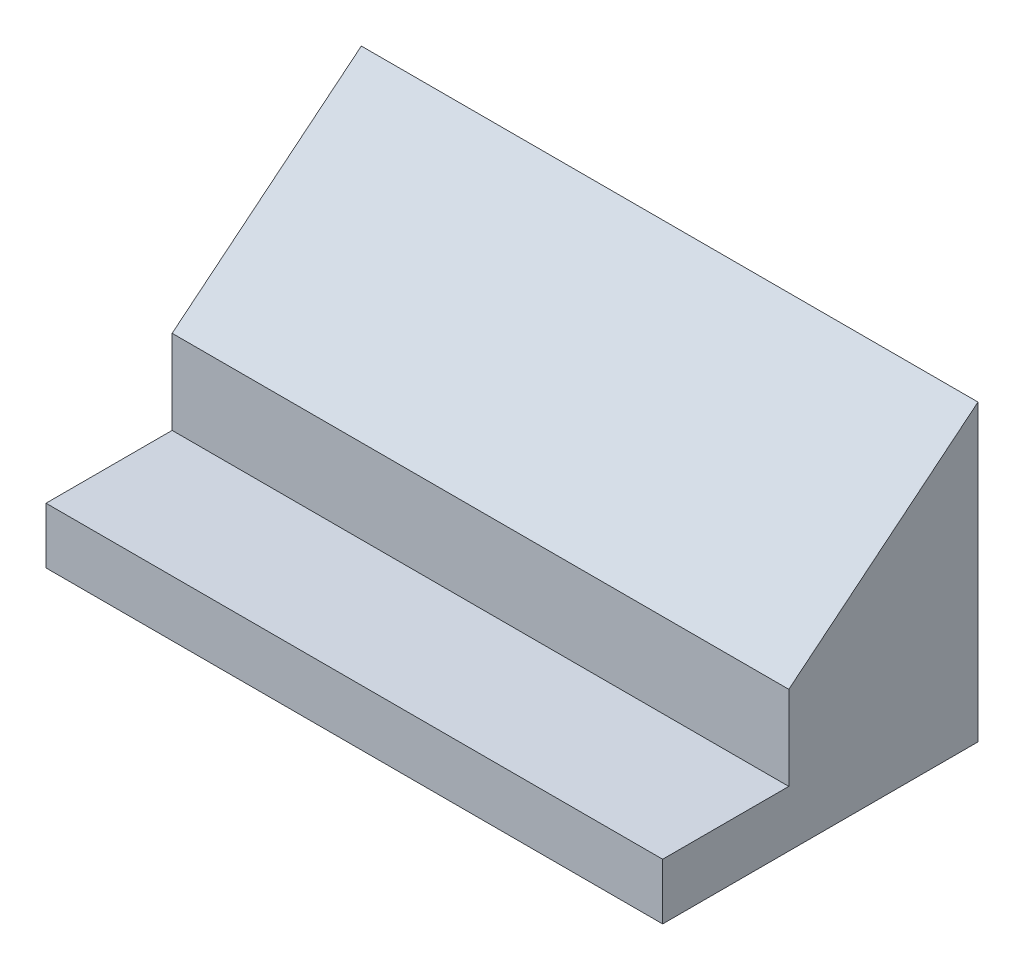
ISO-10303-21;
HEADER;
FILE_DESCRIPTION(('STEP AP214'),'2;1');
FILE_NAME('part.step','',(''),(''),'','','');
FILE_SCHEMA(('AUTOMOTIVE_DESIGN { 1 0 10303 214 1 1 1 1 }'));
ENDSEC;
DATA;
#1=APPLICATION_CONTEXT('core data for automotive mechanical design processes');
#2=APPLICATION_PROTOCOL_DEFINITION('international standard','automotive_design',2000,#1);
#3=PRODUCT_CONTEXT('',#1,'mechanical');
#4=PRODUCT('Part','Part','',(#3));
#5=PRODUCT_RELATED_PRODUCT_CATEGORY('part','',(#4));
#6=PRODUCT_DEFINITION_FORMATION('','',#4);
#7=PRODUCT_DEFINITION_CONTEXT('part definition',#1,'design');
#8=PRODUCT_DEFINITION('design','',#6,#7);
#9=PRODUCT_DEFINITION_SHAPE('','',#8);
#10=(LENGTH_UNIT() NAMED_UNIT(*) SI_UNIT(.MILLI.,.METRE.));
#11=(NAMED_UNIT(*) PLANE_ANGLE_UNIT() SI_UNIT($,.RADIAN.));
#12=(NAMED_UNIT(*) SI_UNIT($,.STERADIAN.) SOLID_ANGLE_UNIT());
#13=UNCERTAINTY_MEASURE_WITH_UNIT(LENGTH_MEASURE(1.E-05),#10,'distance_accuracy_value','');
#14=(GEOMETRIC_REPRESENTATION_CONTEXT(3) GLOBAL_UNCERTAINTY_ASSIGNED_CONTEXT((#13)) GLOBAL_UNIT_ASSIGNED_CONTEXT((#10,
#11,#12)) REPRESENTATION_CONTEXT('',''));
#15=CARTESIAN_POINT('',(0.,0.,0.));
#16=DIRECTION('',(0.,0.,1.));
#17=DIRECTION('',(1.,0.,0.));
#18=AXIS2_PLACEMENT_3D('',#15,#16,#17);
#19=CARTESIAN_POINT('',(8.8,0.,0.));
#20=DIRECTION('',(0.,0.,-1.));
#21=DIRECTION('',(-1.,0.,0.));
#22=AXIS2_PLACEMENT_3D('',#19,#20,#21);
#23=PLANE('',#22);
#24=DIRECTION('',(0.,-1.,0.));
#25=VECTOR('',#24,1.);
#26=CARTESIAN_POINT('',(0.,0.,0.));
#27=LINE('',#26,#25);
#28=CARTESIAN_POINT('',(0.,0.8,0.));
#29=VERTEX_POINT('',#28);
#30=CARTESIAN_POINT('',(0.,0.,0.));
#31=VERTEX_POINT('',#30);
#32=EDGE_CURVE('E128',#29,#31,#27,.T.);
#33=ORIENTED_EDGE('',*,*,#32,.T.);
#34=DIRECTION('',(-1.,0.,0.));
#35=VECTOR('',#34,1.);
#36=CARTESIAN_POINT('',(8.8,0.,0.));
#37=LINE('',#36,#35);
#38=CARTESIAN_POINT('',(8.8,0.,0.));
#39=VERTEX_POINT('',#38);
#40=EDGE_CURVE('E11',#39,#31,#37,.T.);
#41=ORIENTED_EDGE('',*,*,#40,.F.);
#42=DIRECTION('',(0.,-1.,0.));
#43=VECTOR('',#42,1.);
#44=CARTESIAN_POINT('',(8.8,0.,0.));
#45=LINE('',#44,#43);
#46=CARTESIAN_POINT('',(8.8,0.8,0.));
#47=VERTEX_POINT('',#46);
#48=EDGE_CURVE('E144',#47,#39,#45,.T.);
#49=ORIENTED_EDGE('',*,*,#48,.F.);
#50=DIRECTION('',(-1.,0.,0.));
#51=VECTOR('',#50,1.);
#52=CARTESIAN_POINT('',(8.8,0.8,0.));
#53=LINE('',#52,#51);
#54=EDGE_CURVE('E124',#47,#29,#53,.T.);
#55=ORIENTED_EDGE('',*,*,#54,.T.);
#56=EDGE_LOOP('',(#33,#41,#49,#55));
#57=FACE_BOUND('',#56,.T.);
#58=ADVANCED_FACE('F39',(#57),#23,.F.);
#59=CARTESIAN_POINT('',(8.8,0.,0.));
#60=DIRECTION('',(0.,1.,0.));
#61=DIRECTION('',(0.,0.,1.));
#62=AXIS2_PLACEMENT_3D('',#59,#60,#61);
#63=PLANE('',#62);
#64=DIRECTION('',(0.,0.,-1.));
#65=VECTOR('',#64,1.);
#66=CARTESIAN_POINT('',(0.,0.,0.));
#67=LINE('',#66,#65);
#68=CARTESIAN_POINT('',(0.,0.,-4.5));
#69=VERTEX_POINT('',#68);
#70=EDGE_CURVE('E132',#31,#69,#67,.T.);
#71=ORIENTED_EDGE('',*,*,#70,.T.);
#72=DIRECTION('',(-1.,0.,0.));
#73=VECTOR('',#72,1.);
#74=CARTESIAN_POINT('',(8.8,0.,-4.5));
#75=LINE('',#74,#73);
#76=CARTESIAN_POINT('',(8.8,0.,-4.5));
#77=VERTEX_POINT('',#76);
#78=EDGE_CURVE('E48',#77,#69,#75,.T.);
#79=ORIENTED_EDGE('',*,*,#78,.F.);
#80=DIRECTION('',(0.,0.,-1.));
#81=VECTOR('',#80,1.);
#82=CARTESIAN_POINT('',(8.8,0.,0.));
#83=LINE('',#82,#81);
#84=EDGE_CURVE('E93',#39,#77,#83,.T.);
#85=ORIENTED_EDGE('',*,*,#84,.F.);
#86=ORIENTED_EDGE('',*,*,#40,.T.);
#87=EDGE_LOOP('',(#71,#79,#85,#86));
#88=FACE_BOUND('',#87,.T.);
#89=ADVANCED_FACE('F172',(#88),#63,.F.);
#90=CARTESIAN_POINT('',(8.8,0.,-4.5));
#91=DIRECTION('',(0.,0.,1.));
#92=DIRECTION('',(1.,0.,0.));
#93=AXIS2_PLACEMENT_3D('',#90,#91,#92);
#94=PLANE('',#93);
#95=DIRECTION('',(0.,1.,0.));
#96=VECTOR('',#95,1.);
#97=CARTESIAN_POINT('',(0.,0.,-4.5));
#98=LINE('',#97,#96);
#99=CARTESIAN_POINT('',(0.,4.2,-4.5));
#100=VERTEX_POINT('',#99);
#101=EDGE_CURVE('E135',#69,#100,#98,.T.);
#102=ORIENTED_EDGE('',*,*,#101,.T.);
#103=DIRECTION('',(-1.,0.,0.));
#104=VECTOR('',#103,1.);
#105=CARTESIAN_POINT('',(8.8,4.2,-4.5));
#106=LINE('',#105,#104);
#107=CARTESIAN_POINT('',(8.8,4.2,-4.5));
#108=VERTEX_POINT('',#107);
#109=EDGE_CURVE('E117',#108,#100,#106,.T.);
#110=ORIENTED_EDGE('',*,*,#109,.F.);
#111=DIRECTION('',(0.,1.,0.));
#112=VECTOR('',#111,1.);
#113=CARTESIAN_POINT('',(8.8,0.,-4.5));
#114=LINE('',#113,#112);
#115=EDGE_CURVE('E106',#77,#108,#114,.T.);
#116=ORIENTED_EDGE('',*,*,#115,.F.);
#117=ORIENTED_EDGE('',*,*,#78,.T.);
#118=EDGE_LOOP('',(#102,#110,#116,#117));
#119=FACE_BOUND('',#118,.T.);
#120=ADVANCED_FACE('F154',(#119),#94,.F.);
#121=CARTESIAN_POINT('',(8.8,2.,-1.8));
#122=DIRECTION('',(0.,-0.775234985517289,-0.631672951162236));
#123=DIRECTION('',(0.,0.631672951162236,-0.775234985517289));
#124=AXIS2_PLACEMENT_3D('',#121,#122,#123);
#125=PLANE('',#124);
#126=DIRECTION('',(0.,-0.631672951162236,0.775234985517289));
#127=VECTOR('',#126,1.);
#128=CARTESIAN_POINT('',(0.,2.,-1.8));
#129=LINE('',#128,#127);
#130=CARTESIAN_POINT('',(0.,2.,-1.8));
#131=VERTEX_POINT('',#130);
#132=EDGE_CURVE('E115',#100,#131,#129,.T.);
#133=ORIENTED_EDGE('',*,*,#132,.T.);
#134=DIRECTION('',(-1.,0.,0.));
#135=VECTOR('',#134,1.);
#136=CARTESIAN_POINT('',(8.8,2.,-1.8));
#137=LINE('',#136,#135);
#138=CARTESIAN_POINT('',(8.8,2.,-1.8));
#139=VERTEX_POINT('',#138);
#140=EDGE_CURVE('E112',#139,#131,#137,.T.);
#141=ORIENTED_EDGE('',*,*,#140,.F.);
#142=DIRECTION('',(0.,-0.631672951162236,0.775234985517289));
#143=VECTOR('',#142,1.);
#144=CARTESIAN_POINT('',(8.8,2.,-1.8));
#145=LINE('',#144,#143);
#146=EDGE_CURVE('E100',#108,#139,#145,.T.);
#147=ORIENTED_EDGE('',*,*,#146,.F.);
#148=ORIENTED_EDGE('',*,*,#109,.T.);
#149=EDGE_LOOP('',(#133,#141,#147,#148));
#150=FACE_BOUND('',#149,.T.);
#151=ADVANCED_FACE('F113',(#150),#125,.F.);
#152=CARTESIAN_POINT('',(8.8,0.8,-1.8));
#153=DIRECTION('',(0.,0.,-1.));
#154=DIRECTION('',(-1.,0.,0.));
#155=AXIS2_PLACEMENT_3D('',#152,#153,#154);
#156=PLANE('',#155);
#157=DIRECTION('',(0.,-1.,0.));
#158=VECTOR('',#157,1.);
#159=CARTESIAN_POINT('',(0.,0.8,-1.8));
#160=LINE('',#159,#158);
#161=CARTESIAN_POINT('',(0.,0.8,-1.8));
#162=VERTEX_POINT('',#161);
#163=EDGE_CURVE('E79',#131,#162,#160,.T.);
#164=ORIENTED_EDGE('',*,*,#163,.T.);
#165=DIRECTION('',(-1.,0.,0.));
#166=VECTOR('',#165,1.);
#167=CARTESIAN_POINT('',(8.8,0.8,-1.8));
#168=LINE('',#167,#166);
#169=CARTESIAN_POINT('',(8.8,0.8,-1.8));
#170=VERTEX_POINT('',#169);
#171=EDGE_CURVE('E118',#170,#162,#168,.T.);
#172=ORIENTED_EDGE('',*,*,#171,.F.);
#173=DIRECTION('',(0.,-1.,0.));
#174=VECTOR('',#173,1.);
#175=CARTESIAN_POINT('',(8.8,0.8,-1.8));
#176=LINE('',#175,#174);
#177=EDGE_CURVE('E104',#139,#170,#176,.T.);
#178=ORIENTED_EDGE('',*,*,#177,.F.);
#179=ORIENTED_EDGE('',*,*,#140,.T.);
#180=EDGE_LOOP('',(#164,#172,#178,#179));
#181=FACE_BOUND('',#180,.T.);
#182=ADVANCED_FACE('F120',(#181),#156,.F.);
#183=CARTESIAN_POINT('',(8.8,0.8,0.));
#184=DIRECTION('',(0.,-1.,0.));
#185=DIRECTION('',(0.,0.,-1.));
#186=AXIS2_PLACEMENT_3D('',#183,#184,#185);
#187=PLANE('',#186);
#188=DIRECTION('',(0.,0.,1.));
#189=VECTOR('',#188,1.);
#190=CARTESIAN_POINT('',(0.,0.8,0.));
#191=LINE('',#190,#189);
#192=EDGE_CURVE('E85',#162,#29,#191,.T.);
#193=ORIENTED_EDGE('',*,*,#192,.T.);
#194=ORIENTED_EDGE('',*,*,#54,.F.);
#195=DIRECTION('',(0.,0.,1.));
#196=VECTOR('',#195,1.);
#197=CARTESIAN_POINT('',(8.8,0.8,0.));
#198=LINE('',#197,#196);
#199=EDGE_CURVE('E56',#170,#47,#198,.T.);
#200=ORIENTED_EDGE('',*,*,#199,.F.);
#201=ORIENTED_EDGE('',*,*,#171,.T.);
#202=EDGE_LOOP('',(#193,#194,#200,#201));
#203=FACE_BOUND('',#202,.T.);
#204=ADVANCED_FACE('F161',(#203),#187,.F.);
#205=CARTESIAN_POINT('',(8.8,0.,0.));
#206=DIRECTION('',(-1.,0.,0.));
#207=DIRECTION('',(0.,0.,1.));
#208=AXIS2_PLACEMENT_3D('',#205,#206,#207);
#209=PLANE('',#208);
#210=ORIENTED_EDGE('',*,*,#48,.T.);
#211=ORIENTED_EDGE('',*,*,#84,.T.);
#212=ORIENTED_EDGE('',*,*,#115,.T.);
#213=ORIENTED_EDGE('',*,*,#146,.T.);
#214=ORIENTED_EDGE('',*,*,#177,.T.);
#215=ORIENTED_EDGE('',*,*,#199,.T.);
#216=EDGE_LOOP('',(#210,#211,#212,#213,#214,#215));
#217=FACE_BOUND('',#216,.T.);
#218=ADVANCED_FACE('F102',(#217),#209,.F.);
#219=CARTESIAN_POINT('',(0.,0.,0.));
#220=DIRECTION('',(-1.,0.,0.));
#221=DIRECTION('',(0.,0.,1.));
#222=AXIS2_PLACEMENT_3D('',#219,#220,#221);
#223=PLANE('',#222);
#224=ORIENTED_EDGE('',*,*,#32,.F.);
#225=ORIENTED_EDGE('',*,*,#192,.F.);
#226=ORIENTED_EDGE('',*,*,#163,.F.);
#227=ORIENTED_EDGE('',*,*,#132,.F.);
#228=ORIENTED_EDGE('',*,*,#101,.F.);
#229=ORIENTED_EDGE('',*,*,#70,.F.);
#230=EDGE_LOOP('',(#224,#225,#226,#227,#228,#229));
#231=FACE_BOUND('',#230,.T.);
#232=ADVANCED_FACE('F157',(#231),#223,.T.);
#233=CLOSED_SHELL('',(#58,#89,#120,#151,#182,#204,#218,#232));
#234=MANIFOLD_SOLID_BREP('B2',#233);
#235=ADVANCED_BREP_SHAPE_REPRESENTATION('',(#18,#234),#14);
#236=SHAPE_DEFINITION_REPRESENTATION(#9,#235);
ENDSEC;
END-ISO-10303-21;
